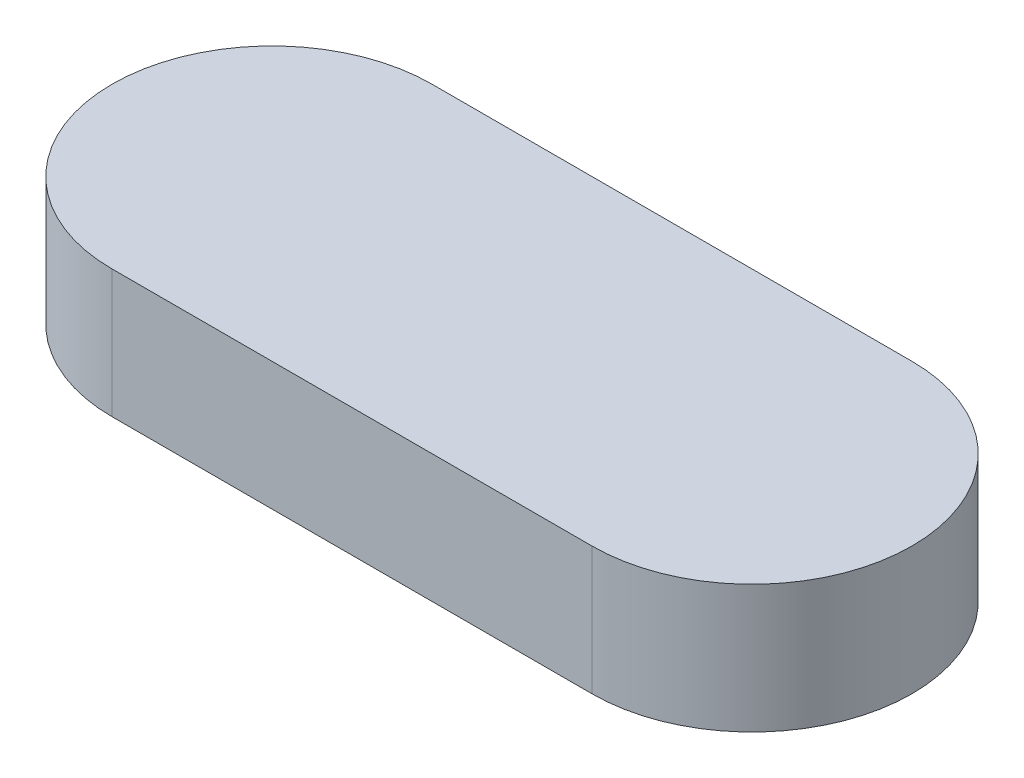
ISO-10303-21;
HEADER;
FILE_DESCRIPTION(('STEP AP214'),'2;1');
FILE_NAME('part.step','',(''),(''),'','','');
FILE_SCHEMA(('AUTOMOTIVE_DESIGN { 1 0 10303 214 1 1 1 1 }'));
ENDSEC;
DATA;
#1=APPLICATION_CONTEXT('core data for automotive mechanical design processes');
#2=APPLICATION_PROTOCOL_DEFINITION('international standard','automotive_design',2000,#1);
#3=PRODUCT_CONTEXT('',#1,'mechanical');
#4=PRODUCT('Part','Part','',(#3));
#5=PRODUCT_RELATED_PRODUCT_CATEGORY('part','',(#4));
#6=PRODUCT_DEFINITION_FORMATION('','',#4);
#7=PRODUCT_DEFINITION_CONTEXT('part definition',#1,'design');
#8=PRODUCT_DEFINITION('design','',#6,#7);
#9=PRODUCT_DEFINITION_SHAPE('','',#8);
#10=(LENGTH_UNIT() NAMED_UNIT(*) SI_UNIT(.MILLI.,.METRE.));
#11=(NAMED_UNIT(*) PLANE_ANGLE_UNIT() SI_UNIT($,.RADIAN.));
#12=(NAMED_UNIT(*) SI_UNIT($,.STERADIAN.) SOLID_ANGLE_UNIT());
#13=UNCERTAINTY_MEASURE_WITH_UNIT(LENGTH_MEASURE(1.E-05),#10,'distance_accuracy_value','');
#14=(GEOMETRIC_REPRESENTATION_CONTEXT(3) GLOBAL_UNCERTAINTY_ASSIGNED_CONTEXT((#13)) GLOBAL_UNIT_ASSIGNED_CONTEXT((#10,
#11,#12)) REPRESENTATION_CONTEXT('',''));
#15=CARTESIAN_POINT('',(0.,0.,0.));
#16=DIRECTION('',(0.,0.,1.));
#17=DIRECTION('',(1.,0.,0.));
#18=AXIS2_PLACEMENT_3D('',#15,#16,#17);
#19=CARTESIAN_POINT('',(-15.,7.99999999999998,-10.));
#20=DIRECTION('',(0.,0.,1.));
#21=DIRECTION('',(1.,0.,0.));
#22=AXIS2_PLACEMENT_3D('',#19,#20,#21);
#23=PLANE('',#22);
#24=DIRECTION('',(-1.,0.,0.));
#25=VECTOR('',#24,1.);
#26=CARTESIAN_POINT('',(15.,0.5,-10.));
#27=LINE('',#26,#25);
#28=CARTESIAN_POINT('',(15.,0.5,-10.));
#29=VERTEX_POINT('',#28);
#30=CARTESIAN_POINT('',(-15.,0.5,-10.));
#31=VERTEX_POINT('',#30);
#32=EDGE_CURVE('E245',#29,#31,#27,.T.);
#33=ORIENTED_EDGE('',*,*,#32,.F.);
#34=DIRECTION('',(0.,-1.,0.));
#35=VECTOR('',#34,1.);
#36=CARTESIAN_POINT('',(15.,7.99999999999998,-10.));
#37=LINE('',#36,#35);
#38=CARTESIAN_POINT('',(15.,0.,-10.));
#39=VERTEX_POINT('',#38);
#40=EDGE_CURVE('E50',#29,#39,#37,.T.);
#41=ORIENTED_EDGE('',*,*,#40,.T.);
#42=DIRECTION('',(-1.,0.,0.));
#43=VECTOR('',#42,1.);
#44=CARTESIAN_POINT('',(-15.,0.,-10.));
#45=LINE('',#44,#43);
#46=CARTESIAN_POINT('',(-15.,0.,-10.));
#47=VERTEX_POINT('',#46);
#48=EDGE_CURVE('E477',#39,#47,#45,.T.);
#49=ORIENTED_EDGE('',*,*,#48,.T.);
#50=DIRECTION('',(0.,-1.,0.));
#51=VECTOR('',#50,1.);
#52=CARTESIAN_POINT('',(-15.,7.99999999999998,-10.));
#53=LINE('',#52,#51);
#54=EDGE_CURVE('E492',#31,#47,#53,.T.);
#55=ORIENTED_EDGE('',*,*,#54,.F.);
#56=EDGE_LOOP('',(#33,#41,#49,#55));
#57=FACE_BOUND('',#56,.T.);
#58=ADVANCED_FACE('F41',(#57),#23,.F.);
#59=CARTESIAN_POINT('',(15.,7.99999999999998,0.));
#60=DIRECTION('',(0.,-1.,0.));
#61=DIRECTION('',(0.,0.,-1.));
#62=AXIS2_PLACEMENT_3D('',#59,#60,#61);
#63=CYLINDRICAL_SURFACE('',#62,10.);
#64=CARTESIAN_POINT('',(15.,0.,0.));
#65=DIRECTION('',(0.,1.,0.));
#66=DIRECTION('',(0.,0.,-1.));
#67=AXIS2_PLACEMENT_3D('',#64,#65,#66);
#68=CIRCLE('',#67,10.);
#69=CARTESIAN_POINT('',(15.,0.,10.));
#70=VERTEX_POINT('',#69);
#71=EDGE_CURVE('E449',#70,#39,#68,.T.);
#72=ORIENTED_EDGE('',*,*,#71,.T.);
#73=ORIENTED_EDGE('',*,*,#40,.F.);
#74=DIRECTION('',(0.,-1.,0.));
#75=VECTOR('',#74,1.);
#76=CARTESIAN_POINT('',(15.,7.99999999999998,-10.));
#77=LINE('',#76,#75);
#78=CARTESIAN_POINT('',(15.,7.49999999999998,-10.));
#79=VERTEX_POINT('',#78);
#80=EDGE_CURVE('E255',#79,#29,#77,.T.);
#81=ORIENTED_EDGE('',*,*,#80,.F.);
#82=CARTESIAN_POINT('',(15.,7.99999999999998,-10.));
#83=VERTEX_POINT('',#82);
#84=EDGE_CURVE('E11',#83,#79,#37,.T.);
#85=ORIENTED_EDGE('',*,*,#84,.F.);
#86=CARTESIAN_POINT('',(15.,7.99999999999998,0.));
#87=DIRECTION('',(0.,1.,0.));
#88=DIRECTION('',(0.,0.,-1.));
#89=AXIS2_PLACEMENT_3D('',#86,#87,#88);
#90=CIRCLE('',#89,10.);
#91=CARTESIAN_POINT('',(15.,7.99999999999998,10.));
#92=VERTEX_POINT('',#91);
#93=EDGE_CURVE('E459',#92,#83,#90,.T.);
#94=ORIENTED_EDGE('',*,*,#93,.F.);
#95=DIRECTION('',(0.,-1.,0.));
#96=VECTOR('',#95,1.);
#97=CARTESIAN_POINT('',(15.,7.99999999999998,10.));
#98=LINE('',#97,#96);
#99=EDGE_CURVE('E473',#92,#70,#98,.T.);
#100=ORIENTED_EDGE('',*,*,#99,.T.);
#101=EDGE_LOOP('',(#72,#73,#81,#85,#94,#100));
#102=FACE_BOUND('',#101,.T.);
#103=ADVANCED_FACE('F43',(#102),#63,.T.);
#104=ORIENTED_EDGE('',*,*,#84,.T.);
#105=DIRECTION('',(-1.,0.,0.));
#106=VECTOR('',#105,1.);
#107=CARTESIAN_POINT('',(15.,7.49999999999998,-10.));
#108=LINE('',#107,#106);
#109=CARTESIAN_POINT('',(-15.,7.49999999999998,-10.));
#110=VERTEX_POINT('',#109);
#111=EDGE_CURVE('E258',#79,#110,#108,.T.);
#112=ORIENTED_EDGE('',*,*,#111,.T.);
#113=CARTESIAN_POINT('',(-15.,7.99999999999998,-10.));
#114=VERTEX_POINT('',#113);
#115=EDGE_CURVE('E493',#114,#110,#53,.T.);
#116=ORIENTED_EDGE('',*,*,#115,.F.);
#117=DIRECTION('',(-1.,0.,0.));
#118=VECTOR('',#117,1.);
#119=CARTESIAN_POINT('',(-15.,7.99999999999998,-10.));
#120=LINE('',#119,#118);
#121=EDGE_CURVE('E463',#83,#114,#120,.T.);
#122=ORIENTED_EDGE('',*,*,#121,.F.);
#123=EDGE_LOOP('',(#104,#112,#116,#122));
#124=FACE_BOUND('',#123,.T.);
#125=ADVANCED_FACE('F525',(#124),#23,.F.);
#126=CARTESIAN_POINT('',(-15.,7.99999999999998,0.));
#127=DIRECTION('',(0.,-1.,0.));
#128=DIRECTION('',(0.,0.,-1.));
#129=AXIS2_PLACEMENT_3D('',#126,#127,#128);
#130=CYLINDRICAL_SURFACE('',#129,10.);
#131=CARTESIAN_POINT('',(-15.,0.,0.));
#132=DIRECTION('',(0.,1.,0.));
#133=DIRECTION('',(0.,0.,1.));
#134=AXIS2_PLACEMENT_3D('',#131,#132,#133);
#135=CIRCLE('',#134,10.);
#136=CARTESIAN_POINT('',(-15.,0.,10.));
#137=VERTEX_POINT('',#136);
#138=EDGE_CURVE('E481',#47,#137,#135,.T.);
#139=ORIENTED_EDGE('',*,*,#138,.T.);
#140=DIRECTION('',(0.,-1.,0.));
#141=VECTOR('',#140,1.);
#142=CARTESIAN_POINT('',(-15.,7.99999999999998,10.));
#143=LINE('',#142,#141);
#144=CARTESIAN_POINT('',(-15.,7.99999999999998,10.));
#145=VERTEX_POINT('',#144);
#146=EDGE_CURVE('E489',#145,#137,#143,.T.);
#147=ORIENTED_EDGE('',*,*,#146,.F.);
#148=CARTESIAN_POINT('',(-15.,7.99999999999998,0.));
#149=DIRECTION('',(0.,1.,0.));
#150=DIRECTION('',(0.,0.,1.));
#151=AXIS2_PLACEMENT_3D('',#148,#149,#150);
#152=CIRCLE('',#151,10.);
#153=EDGE_CURVE('E467',#114,#145,#152,.T.);
#154=ORIENTED_EDGE('',*,*,#153,.F.);
#155=ORIENTED_EDGE('',*,*,#115,.T.);
#156=DIRECTION('',(0.,-1.,0.));
#157=VECTOR('',#156,1.);
#158=CARTESIAN_POINT('',(-15.,7.99999999999998,-10.));
#159=LINE('',#158,#157);
#160=EDGE_CURVE('E265',#110,#31,#159,.T.);
#161=ORIENTED_EDGE('',*,*,#160,.T.);
#162=ORIENTED_EDGE('',*,*,#54,.T.);
#163=EDGE_LOOP('',(#139,#147,#154,#155,#161,#162));
#164=FACE_BOUND('',#163,.T.);
#165=ADVANCED_FACE('F503',(#164),#130,.T.);
#166=CARTESIAN_POINT('',(-15.,7.99999999999998,10.));
#167=DIRECTION('',(0.,0.,-1.));
#168=DIRECTION('',(-1.,0.,0.));
#169=AXIS2_PLACEMENT_3D('',#166,#167,#168);
#170=PLANE('',#169);
#171=DIRECTION('',(1.,0.,0.));
#172=VECTOR('',#171,1.);
#173=CARTESIAN_POINT('',(-15.,0.,10.));
#174=LINE('',#173,#172);
#175=EDGE_CURVE('E464',#137,#70,#174,.T.);
#176=ORIENTED_EDGE('',*,*,#175,.T.);
#177=ORIENTED_EDGE('',*,*,#99,.F.);
#178=DIRECTION('',(1.,0.,0.));
#179=VECTOR('',#178,1.);
#180=CARTESIAN_POINT('',(-15.,7.99999999999998,10.));
#181=LINE('',#180,#179);
#182=EDGE_CURVE('E470',#145,#92,#181,.T.);
#183=ORIENTED_EDGE('',*,*,#182,.F.);
#184=ORIENTED_EDGE('',*,*,#146,.T.);
#185=EDGE_LOOP('',(#176,#177,#183,#184));
#186=FACE_BOUND('',#185,.T.);
#187=ADVANCED_FACE('F516',(#186),#170,.F.);
#188=CARTESIAN_POINT('',(15.,7.99999999999998,0.));
#189=DIRECTION('',(0.,-1.,0.));
#190=DIRECTION('',(0.,0.,-1.));
#191=AXIS2_PLACEMENT_3D('',#188,#189,#190);
#192=PLANE('',#191);
#193=ORIENTED_EDGE('',*,*,#93,.T.);
#194=ORIENTED_EDGE('',*,*,#121,.T.);
#195=ORIENTED_EDGE('',*,*,#153,.T.);
#196=ORIENTED_EDGE('',*,*,#182,.T.);
#197=EDGE_LOOP('',(#193,#194,#195,#196));
#198=FACE_BOUND('',#197,.T.);
#199=ADVANCED_FACE('F523',(#198),#192,.F.);
#200=CARTESIAN_POINT('',(15.,0.,0.));
#201=DIRECTION('',(0.,-1.,0.));
#202=DIRECTION('',(0.,0.,-1.));
#203=AXIS2_PLACEMENT_3D('',#200,#201,#202);
#204=PLANE('',#203);
#205=CARTESIAN_POINT('',(-5.,0.,0.));
#206=DIRECTION('',(0.,-1.,0.));
#207=DIRECTION('',(0.,0.,-1.));
#208=AXIS2_PLACEMENT_3D('',#205,#206,#207);
#209=CIRCLE('',#208,5.);
#210=CARTESIAN_POINT('',(-5.,0.,5.));
#211=VERTEX_POINT('',#210);
#212=CARTESIAN_POINT('',(-5.,0.,-5.));
#213=VERTEX_POINT('',#212);
#214=EDGE_CURVE('E406',#211,#213,#209,.T.);
#215=ORIENTED_EDGE('',*,*,#214,.F.);
#216=DIRECTION('',(-1.,0.,0.));
#217=VECTOR('',#216,1.);
#218=CARTESIAN_POINT('',(-5.,0.,5.));
#219=LINE('',#218,#217);
#220=CARTESIAN_POINT('',(5.,0.,5.));
#221=VERTEX_POINT('',#220);
#222=EDGE_CURVE('E420',#221,#211,#219,.T.);
#223=ORIENTED_EDGE('',*,*,#222,.F.);
#224=CARTESIAN_POINT('',(5.,0.,0.));
#225=DIRECTION('',(0.,-1.,0.));
#226=DIRECTION('',(0.,0.,-1.));
#227=AXIS2_PLACEMENT_3D('',#224,#225,#226);
#228=CIRCLE('',#227,5.);
#229=CARTESIAN_POINT('',(5.,0.,-5.));
#230=VERTEX_POINT('',#229);
#231=EDGE_CURVE('E439',#230,#221,#228,.T.);
#232=ORIENTED_EDGE('',*,*,#231,.F.);
#233=DIRECTION('',(1.,0.,0.));
#234=VECTOR('',#233,1.);
#235=CARTESIAN_POINT('',(-5.,0.,-5.));
#236=LINE('',#235,#234);
#237=EDGE_CURVE('E435',#213,#230,#236,.T.);
#238=ORIENTED_EDGE('',*,*,#237,.F.);
#239=EDGE_LOOP('',(#215,#223,#232,#238));
#240=FACE_BOUND('',#239,.T.);
#241=ORIENTED_EDGE('',*,*,#71,.F.);
#242=ORIENTED_EDGE('',*,*,#175,.F.);
#243=ORIENTED_EDGE('',*,*,#138,.F.);
#244=ORIENTED_EDGE('',*,*,#48,.F.);
#245=EDGE_LOOP('',(#241,#242,#243,#244));
#246=FACE_BOUND('',#245,.T.);
#247=ADVANCED_FACE('F513',(#240,#246),#204,.T.);
#248=CARTESIAN_POINT('',(-5.,0.99999999999999,0.));
#249=DIRECTION('',(0.,-1.,0.));
#250=DIRECTION('',(0.,0.,-1.));
#251=AXIS2_PLACEMENT_3D('',#248,#249,#250);
#252=CYLINDRICAL_SURFACE('',#251,5.);
#253=ORIENTED_EDGE('',*,*,#214,.T.);
#254=DIRECTION('',(0.,-1.,0.));
#255=VECTOR('',#254,1.);
#256=CARTESIAN_POINT('',(-5.,0.99999999999999,-5.));
#257=LINE('',#256,#255);
#258=CARTESIAN_POINT('',(-5.,0.99999999999999,-5.));
#259=VERTEX_POINT('',#258);
#260=EDGE_CURVE('E432',#259,#213,#257,.T.);
#261=ORIENTED_EDGE('',*,*,#260,.F.);
#262=CARTESIAN_POINT('',(-5.,0.99999999999999,0.));
#263=DIRECTION('',(0.,-1.,0.));
#264=DIRECTION('',(0.,0.,-1.));
#265=AXIS2_PLACEMENT_3D('',#262,#263,#264);
#266=CIRCLE('',#265,5.);
#267=CARTESIAN_POINT('',(-5.,0.99999999999999,5.));
#268=VERTEX_POINT('',#267);
#269=EDGE_CURVE('E415',#268,#259,#266,.T.);
#270=ORIENTED_EDGE('',*,*,#269,.F.);
#271=DIRECTION('',(0.,-1.,0.));
#272=VECTOR('',#271,1.);
#273=CARTESIAN_POINT('',(-5.,0.99999999999999,5.));
#274=LINE('',#273,#272);
#275=EDGE_CURVE('E446',#268,#211,#274,.T.);
#276=ORIENTED_EDGE('',*,*,#275,.T.);
#277=EDGE_LOOP('',(#253,#261,#270,#276));
#278=FACE_BOUND('',#277,.T.);
#279=ADVANCED_FACE('F561',(#278),#252,.F.);
#280=CARTESIAN_POINT('',(-5.,0.99999999999999,5.));
#281=DIRECTION('',(0.,0.,1.));
#282=DIRECTION('',(1.,0.,0.));
#283=AXIS2_PLACEMENT_3D('',#280,#281,#282);
#284=PLANE('',#283);
#285=ORIENTED_EDGE('',*,*,#222,.T.);
#286=ORIENTED_EDGE('',*,*,#275,.F.);
#287=DIRECTION('',(-1.,0.,0.));
#288=VECTOR('',#287,1.);
#289=CARTESIAN_POINT('',(-5.,0.99999999999999,5.));
#290=LINE('',#289,#288);
#291=CARTESIAN_POINT('',(5.,0.99999999999999,5.));
#292=VERTEX_POINT('',#291);
#293=EDGE_CURVE('E428',#292,#268,#290,.T.);
#294=ORIENTED_EDGE('',*,*,#293,.F.);
#295=DIRECTION('',(0.,-1.,0.));
#296=VECTOR('',#295,1.);
#297=CARTESIAN_POINT('',(5.,0.99999999999999,5.));
#298=LINE('',#297,#296);
#299=EDGE_CURVE('E450',#292,#221,#298,.T.);
#300=ORIENTED_EDGE('',*,*,#299,.T.);
#301=EDGE_LOOP('',(#285,#286,#294,#300));
#302=FACE_BOUND('',#301,.T.);
#303=ADVANCED_FACE('F567',(#302),#284,.F.);
#304=CARTESIAN_POINT('',(5.,0.99999999999999,0.));
#305=DIRECTION('',(0.,-1.,0.));
#306=DIRECTION('',(0.,0.,-1.));
#307=AXIS2_PLACEMENT_3D('',#304,#305,#306);
#308=CYLINDRICAL_SURFACE('',#307,5.);
#309=ORIENTED_EDGE('',*,*,#231,.T.);
#310=ORIENTED_EDGE('',*,*,#299,.F.);
#311=CARTESIAN_POINT('',(5.,0.99999999999999,0.));
#312=DIRECTION('',(0.,-1.,0.));
#313=DIRECTION('',(0.,0.,-1.));
#314=AXIS2_PLACEMENT_3D('',#311,#312,#313);
#315=CIRCLE('',#314,5.);
#316=CARTESIAN_POINT('',(5.,0.99999999999999,-5.));
#317=VERTEX_POINT('',#316);
#318=EDGE_CURVE('E424',#317,#292,#315,.T.);
#319=ORIENTED_EDGE('',*,*,#318,.F.);
#320=DIRECTION('',(0.,-1.,0.));
#321=VECTOR('',#320,1.);
#322=CARTESIAN_POINT('',(5.,0.99999999999999,-5.));
#323=LINE('',#322,#321);
#324=EDGE_CURVE('E453',#317,#230,#323,.T.);
#325=ORIENTED_EDGE('',*,*,#324,.T.);
#326=EDGE_LOOP('',(#309,#310,#319,#325));
#327=FACE_BOUND('',#326,.T.);
#328=ADVANCED_FACE('F573',(#327),#308,.F.);
#329=CARTESIAN_POINT('',(-5.,0.99999999999999,-5.));
#330=DIRECTION('',(0.,0.,-1.));
#331=DIRECTION('',(-1.,0.,0.));
#332=AXIS2_PLACEMENT_3D('',#329,#330,#331);
#333=PLANE('',#332);
#334=ORIENTED_EDGE('',*,*,#237,.T.);
#335=ORIENTED_EDGE('',*,*,#324,.F.);
#336=DIRECTION('',(1.,0.,0.));
#337=VECTOR('',#336,1.);
#338=CARTESIAN_POINT('',(-5.,0.99999999999999,-5.));
#339=LINE('',#338,#337);
#340=EDGE_CURVE('E419',#259,#317,#339,.T.);
#341=ORIENTED_EDGE('',*,*,#340,.F.);
#342=ORIENTED_EDGE('',*,*,#260,.T.);
#343=EDGE_LOOP('',(#334,#335,#341,#342));
#344=FACE_BOUND('',#343,.T.);
#345=ADVANCED_FACE('F569',(#344),#333,.F.);
#346=CARTESIAN_POINT('',(-5.,0.99999999999999,0.));
#347=DIRECTION('',(0.,-1.,0.));
#348=DIRECTION('',(0.,0.,-1.));
#349=AXIS2_PLACEMENT_3D('',#346,#347,#348);
#350=PLANE('',#349);
#351=DIRECTION('',(0.,0.,1.));
#352=VECTOR('',#351,1.);
#353=CARTESIAN_POINT('',(8.,0.99999999999999,-3.5));
#354=LINE('',#353,#352);
#355=CARTESIAN_POINT('',(8.,0.99999999999999,-3.5));
#356=VERTEX_POINT('',#355);
#357=CARTESIAN_POINT('',(8.,0.99999999999999,3.5));
#358=VERTEX_POINT('',#357);
#359=EDGE_CURVE('E359',#356,#358,#354,.T.);
#360=ORIENTED_EDGE('',*,*,#359,.F.);
#361=DIRECTION('',(1.,0.,0.));
#362=VECTOR('',#361,1.);
#363=CARTESIAN_POINT('',(-8.,0.99999999999999,-3.5));
#364=LINE('',#363,#362);
#365=CARTESIAN_POINT('',(-8.,0.99999999999999,-3.5));
#366=VERTEX_POINT('',#365);
#367=EDGE_CURVE('E381',#366,#356,#364,.T.);
#368=ORIENTED_EDGE('',*,*,#367,.F.);
#369=DIRECTION('',(0.,0.,-1.));
#370=VECTOR('',#369,1.);
#371=CARTESIAN_POINT('',(-8.,0.99999999999999,-3.5));
#372=LINE('',#371,#370);
#373=CARTESIAN_POINT('',(-8.,0.99999999999999,3.5));
#374=VERTEX_POINT('',#373);
#375=EDGE_CURVE('E65',#374,#366,#372,.T.);
#376=ORIENTED_EDGE('',*,*,#375,.F.);
#377=DIRECTION('',(-1.,0.,0.));
#378=VECTOR('',#377,1.);
#379=CARTESIAN_POINT('',(-8.,0.99999999999999,3.5));
#380=LINE('',#379,#378);
#381=EDGE_CURVE('E394',#358,#374,#380,.T.);
#382=ORIENTED_EDGE('',*,*,#381,.F.);
#383=EDGE_LOOP('',(#360,#368,#376,#382));
#384=FACE_BOUND('',#383,.T.);
#385=ORIENTED_EDGE('',*,*,#269,.T.);
#386=ORIENTED_EDGE('',*,*,#340,.T.);
#387=ORIENTED_EDGE('',*,*,#318,.T.);
#388=ORIENTED_EDGE('',*,*,#293,.T.);
#389=EDGE_LOOP('',(#385,#386,#387,#388));
#390=FACE_BOUND('',#389,.T.);
#391=ADVANCED_FACE('F572',(#384,#390),#350,.T.);
#392=CARTESIAN_POINT('',(8.,1.99999999999998,-3.5));
#393=DIRECTION('',(1.,0.,0.));
#394=DIRECTION('',(0.,0.,-1.));
#395=AXIS2_PLACEMENT_3D('',#392,#393,#394);
#396=PLANE('',#395);
#397=ORIENTED_EDGE('',*,*,#359,.T.);
#398=DIRECTION('',(0.,-1.,0.));
#399=VECTOR('',#398,1.);
#400=CARTESIAN_POINT('',(8.,1.99999999999998,3.5));
#401=LINE('',#400,#399);
#402=CARTESIAN_POINT('',(8.,1.99999999999998,3.5));
#403=VERTEX_POINT('',#402);
#404=EDGE_CURVE('E390',#403,#358,#401,.T.);
#405=ORIENTED_EDGE('',*,*,#404,.F.);
#406=DIRECTION('',(0.,0.,1.));
#407=VECTOR('',#406,1.);
#408=CARTESIAN_POINT('',(8.,1.99999999999998,-3.5));
#409=LINE('',#408,#407);
#410=CARTESIAN_POINT('',(8.,1.99999999999998,-3.5));
#411=VERTEX_POINT('',#410);
#412=EDGE_CURVE('E377',#411,#403,#409,.T.);
#413=ORIENTED_EDGE('',*,*,#412,.F.);
#414=DIRECTION('',(0.,-1.,0.));
#415=VECTOR('',#414,1.);
#416=CARTESIAN_POINT('',(8.,1.99999999999998,-3.5));
#417=LINE('',#416,#415);
#418=EDGE_CURVE('E403',#411,#356,#417,.T.);
#419=ORIENTED_EDGE('',*,*,#418,.T.);
#420=EDGE_LOOP('',(#397,#405,#413,#419));
#421=FACE_BOUND('',#420,.T.);
#422=ADVANCED_FACE('F583',(#421),#396,.F.);
#423=CARTESIAN_POINT('',(-8.,1.99999999999998,-3.5));
#424=DIRECTION('',(0.,0.,-1.));
#425=DIRECTION('',(-1.,0.,0.));
#426=AXIS2_PLACEMENT_3D('',#423,#424,#425);
#427=PLANE('',#426);
#428=ORIENTED_EDGE('',*,*,#367,.T.);
#429=ORIENTED_EDGE('',*,*,#418,.F.);
#430=DIRECTION('',(1.,0.,0.));
#431=VECTOR('',#430,1.);
#432=CARTESIAN_POINT('',(-8.,1.99999999999998,-3.5));
#433=LINE('',#432,#431);
#434=CARTESIAN_POINT('',(-8.,1.99999999999998,-3.5));
#435=VERTEX_POINT('',#434);
#436=EDGE_CURVE('E387',#435,#411,#433,.T.);
#437=ORIENTED_EDGE('',*,*,#436,.F.);
#438=DIRECTION('',(0.,-1.,0.));
#439=VECTOR('',#438,1.);
#440=CARTESIAN_POINT('',(-8.,1.99999999999998,-3.5));
#441=LINE('',#440,#439);
#442=EDGE_CURVE('E407',#435,#366,#441,.T.);
#443=ORIENTED_EDGE('',*,*,#442,.T.);
#444=EDGE_LOOP('',(#428,#429,#437,#443));
#445=FACE_BOUND('',#444,.T.);
#446=ADVANCED_FACE('F587',(#445),#427,.F.);
#447=CARTESIAN_POINT('',(-8.,1.99999999999998,-3.5));
#448=DIRECTION('',(-1.,0.,0.));
#449=DIRECTION('',(0.,0.,1.));
#450=AXIS2_PLACEMENT_3D('',#447,#448,#449);
#451=PLANE('',#450);
#452=ORIENTED_EDGE('',*,*,#375,.T.);
#453=ORIENTED_EDGE('',*,*,#442,.F.);
#454=DIRECTION('',(0.,0.,-1.));
#455=VECTOR('',#454,1.);
#456=CARTESIAN_POINT('',(-8.,1.99999999999998,-3.5));
#457=LINE('',#456,#455);
#458=CARTESIAN_POINT('',(-8.,1.99999999999998,3.5));
#459=VERTEX_POINT('',#458);
#460=EDGE_CURVE('E384',#459,#435,#457,.T.);
#461=ORIENTED_EDGE('',*,*,#460,.F.);
#462=DIRECTION('',(0.,-1.,0.));
#463=VECTOR('',#462,1.);
#464=CARTESIAN_POINT('',(-8.,1.99999999999998,3.5));
#465=LINE('',#464,#463);
#466=EDGE_CURVE('E410',#459,#374,#465,.T.);
#467=ORIENTED_EDGE('',*,*,#466,.T.);
#468=EDGE_LOOP('',(#452,#453,#461,#467));
#469=FACE_BOUND('',#468,.T.);
#470=ADVANCED_FACE('F593',(#469),#451,.F.);
#471=CARTESIAN_POINT('',(-8.,1.99999999999998,3.5));
#472=DIRECTION('',(0.,0.,1.));
#473=DIRECTION('',(1.,0.,0.));
#474=AXIS2_PLACEMENT_3D('',#471,#472,#473);
#475=PLANE('',#474);
#476=ORIENTED_EDGE('',*,*,#381,.T.);
#477=ORIENTED_EDGE('',*,*,#466,.F.);
#478=DIRECTION('',(-1.,0.,0.));
#479=VECTOR('',#478,1.);
#480=CARTESIAN_POINT('',(-8.,1.99999999999998,3.5));
#481=LINE('',#480,#479);
#482=EDGE_CURVE('E380',#403,#459,#481,.T.);
#483=ORIENTED_EDGE('',*,*,#482,.F.);
#484=ORIENTED_EDGE('',*,*,#404,.T.);
#485=EDGE_LOOP('',(#476,#477,#483,#484));
#486=FACE_BOUND('',#485,.T.);
#487=ADVANCED_FACE('F589',(#486),#475,.F.);
#488=CARTESIAN_POINT('',(0.,1.99999999999998,0.));
#489=DIRECTION('',(0.,1.,0.));
#490=DIRECTION('',(0.,0.,1.));
#491=AXIS2_PLACEMENT_3D('',#488,#489,#490);
#492=PLANE('',#491);
#493=DIRECTION('',(0.,0.,1.));
#494=VECTOR('',#493,1.);
#495=CARTESIAN_POINT('',(8.5,1.99999999999998,-3.5));
#496=LINE('',#495,#494);
#497=CARTESIAN_POINT('',(8.5,1.99999999999998,-4.));
#498=VERTEX_POINT('',#497);
#499=CARTESIAN_POINT('',(8.5,1.99999999999998,4.));
#500=VERTEX_POINT('',#499);
#501=EDGE_CURVE('E320',#498,#500,#496,.T.);
#502=ORIENTED_EDGE('',*,*,#501,.F.);
#503=DIRECTION('',(1.,0.,0.));
#504=VECTOR('',#503,1.);
#505=CARTESIAN_POINT('',(-8.,1.99999999999998,-4.));
#506=LINE('',#505,#504);
#507=CARTESIAN_POINT('',(-8.5,1.99999999999998,-4.));
#508=VERTEX_POINT('',#507);
#509=EDGE_CURVE('E331',#508,#498,#506,.T.);
#510=ORIENTED_EDGE('',*,*,#509,.F.);
#511=DIRECTION('',(0.,0.,-1.));
#512=VECTOR('',#511,1.);
#513=CARTESIAN_POINT('',(-8.5,1.99999999999998,-3.5));
#514=LINE('',#513,#512);
#515=CARTESIAN_POINT('',(-8.5,1.99999999999998,4.));
#516=VERTEX_POINT('',#515);
#517=EDGE_CURVE('E367',#516,#508,#514,.T.);
#518=ORIENTED_EDGE('',*,*,#517,.F.);
#519=DIRECTION('',(-1.,0.,0.));
#520=VECTOR('',#519,1.);
#521=CARTESIAN_POINT('',(-8.,1.99999999999998,4.));
#522=LINE('',#521,#520);
#523=EDGE_CURVE('E363',#500,#516,#522,.T.);
#524=ORIENTED_EDGE('',*,*,#523,.F.);
#525=EDGE_LOOP('',(#502,#510,#518,#524));
#526=FACE_BOUND('',#525,.T.);
#527=ORIENTED_EDGE('',*,*,#412,.T.);
#528=ORIENTED_EDGE('',*,*,#482,.T.);
#529=ORIENTED_EDGE('',*,*,#460,.T.);
#530=ORIENTED_EDGE('',*,*,#436,.T.);
#531=EDGE_LOOP('',(#527,#528,#529,#530));
#532=FACE_BOUND('',#531,.T.);
#533=ADVANCED_FACE('F592',(#526,#532),#492,.T.);
#534=CARTESIAN_POINT('',(15.,7.99999999999998,-10.));
#535=DIRECTION('',(-1.,0.,0.));
#536=DIRECTION('',(0.,-1.,0.));
#537=AXIS2_PLACEMENT_3D('',#534,#535,#536);
#538=PLANE('',#537);
#539=ORIENTED_EDGE('',*,*,#80,.T.);
#540=DIRECTION('',(0.,0.,1.));
#541=VECTOR('',#540,1.);
#542=CARTESIAN_POINT('',(15.,0.5,-10.));
#543=LINE('',#542,#541);
#544=CARTESIAN_POINT('',(15.,0.5,-9.5));
#545=VERTEX_POINT('',#544);
#546=EDGE_CURVE('E344',#545,#29,#543,.F.);
#547=ORIENTED_EDGE('',*,*,#546,.F.);
#548=DIRECTION('',(0.,-1.,0.));
#549=VECTOR('',#548,1.);
#550=CARTESIAN_POINT('',(15.,3.99999999999999,-9.5));
#551=LINE('',#550,#549);
#552=CARTESIAN_POINT('',(15.,7.49999999999998,-9.5));
#553=VERTEX_POINT('',#552);
#554=EDGE_CURVE('E243',#553,#545,#551,.T.);
#555=ORIENTED_EDGE('',*,*,#554,.F.);
#556=DIRECTION('',(0.,0.,1.));
#557=VECTOR('',#556,1.);
#558=CARTESIAN_POINT('',(15.,7.49999999999998,-10.));
#559=LINE('',#558,#557);
#560=EDGE_CURVE('E57',#553,#79,#559,.F.);
#561=ORIENTED_EDGE('',*,*,#560,.T.);
#562=EDGE_LOOP('',(#539,#547,#555,#561));
#563=FACE_BOUND('',#562,.T.);
#564=ADVANCED_FACE('F531',(#563),#538,.T.);
#565=CARTESIAN_POINT('',(-15.,7.99999999999998,-10.));
#566=DIRECTION('',(-1.,0.,0.));
#567=DIRECTION('',(0.,-1.,0.));
#568=AXIS2_PLACEMENT_3D('',#565,#566,#567);
#569=PLANE('',#568);
#570=ORIENTED_EDGE('',*,*,#160,.F.);
#571=DIRECTION('',(0.,0.,1.));
#572=VECTOR('',#571,1.);
#573=CARTESIAN_POINT('',(-15.,7.49999999999998,-10.));
#574=LINE('',#573,#572);
#575=CARTESIAN_POINT('',(-15.,7.49999999999998,-9.5));
#576=VERTEX_POINT('',#575);
#577=EDGE_CURVE('E342',#576,#110,#574,.F.);
#578=ORIENTED_EDGE('',*,*,#577,.F.);
#579=DIRECTION('',(0.,-1.,0.));
#580=VECTOR('',#579,1.);
#581=CARTESIAN_POINT('',(-15.,3.99999999999999,-9.5));
#582=LINE('',#581,#580);
#583=CARTESIAN_POINT('',(-15.,0.5,-9.5));
#584=VERTEX_POINT('',#583);
#585=EDGE_CURVE('E343',#576,#584,#582,.T.);
#586=ORIENTED_EDGE('',*,*,#585,.T.);
#587=DIRECTION('',(0.,0.,-1.));
#588=VECTOR('',#587,1.);
#589=CARTESIAN_POINT('',(-15.,0.5,0.));
#590=LINE('',#589,#588);
#591=EDGE_CURVE('E346',#584,#31,#590,.T.);
#592=ORIENTED_EDGE('',*,*,#591,.T.);
#593=EDGE_LOOP('',(#570,#578,#586,#592));
#594=FACE_BOUND('',#593,.T.);
#595=ADVANCED_FACE('F533',(#594),#569,.F.);
#596=CARTESIAN_POINT('',(15.,7.99999999999998,0.));
#597=DIRECTION('',(0.,-1.,0.));
#598=DIRECTION('',(0.,0.,-1.));
#599=AXIS2_PLACEMENT_3D('',#596,#597,#598);
#600=CYLINDRICAL_SURFACE('',#599,9.5);
#601=CARTESIAN_POINT('',(15.,0.5,0.));
#602=DIRECTION('',(0.,-1.,0.));
#603=DIRECTION('',(0.,0.,-1.));
#604=AXIS2_PLACEMENT_3D('',#601,#602,#603);
#605=CIRCLE('',#604,9.5);
#606=CARTESIAN_POINT('',(15.,0.5,9.5));
#607=VERTEX_POINT('',#606);
#608=EDGE_CURVE('E221',#607,#545,#605,.F.);
#609=ORIENTED_EDGE('',*,*,#608,.F.);
#610=DIRECTION('',(0.,-1.,0.));
#611=VECTOR('',#610,1.);
#612=CARTESIAN_POINT('',(15.,7.99999999999998,9.5));
#613=LINE('',#612,#611);
#614=CARTESIAN_POINT('',(15.,7.49999999999998,9.5));
#615=VERTEX_POINT('',#614);
#616=EDGE_CURVE('E231',#615,#607,#613,.T.);
#617=ORIENTED_EDGE('',*,*,#616,.F.);
#618=CARTESIAN_POINT('',(15.,7.49999999999998,0.));
#619=DIRECTION('',(0.,-1.,0.));
#620=DIRECTION('',(0.,0.,-1.));
#621=AXIS2_PLACEMENT_3D('',#618,#619,#620);
#622=CIRCLE('',#621,9.5);
#623=EDGE_CURVE('E228',#615,#553,#622,.F.);
#624=ORIENTED_EDGE('',*,*,#623,.T.);
#625=ORIENTED_EDGE('',*,*,#554,.T.);
#626=EDGE_LOOP('',(#609,#617,#624,#625));
#627=FACE_BOUND('',#626,.T.);
#628=ADVANCED_FACE('F242',(#627),#600,.F.);
#629=CARTESIAN_POINT('',(-15.,7.99999999999998,0.));
#630=DIRECTION('',(0.,-1.,0.));
#631=DIRECTION('',(0.,0.,-1.));
#632=AXIS2_PLACEMENT_3D('',#629,#630,#631);
#633=CYLINDRICAL_SURFACE('',#632,9.5);
#634=CARTESIAN_POINT('',(-15.,0.5,0.));
#635=DIRECTION('',(0.,-1.,0.));
#636=DIRECTION('',(0.,0.,-1.));
#637=AXIS2_PLACEMENT_3D('',#634,#635,#636);
#638=CIRCLE('',#637,9.5);
#639=CARTESIAN_POINT('',(-15.,0.5,9.5));
#640=VERTEX_POINT('',#639);
#641=EDGE_CURVE('E223',#584,#640,#638,.F.);
#642=ORIENTED_EDGE('',*,*,#641,.F.);
#643=ORIENTED_EDGE('',*,*,#585,.F.);
#644=CARTESIAN_POINT('',(-15.,7.49999999999998,0.));
#645=DIRECTION('',(0.,-1.,0.));
#646=DIRECTION('',(0.,0.,-1.));
#647=AXIS2_PLACEMENT_3D('',#644,#645,#646);
#648=CIRCLE('',#647,9.5);
#649=CARTESIAN_POINT('',(-15.,7.49999999999998,9.5));
#650=VERTEX_POINT('',#649);
#651=EDGE_CURVE('E262',#576,#650,#648,.F.);
#652=ORIENTED_EDGE('',*,*,#651,.T.);
#653=DIRECTION('',(0.,1.,0.));
#654=VECTOR('',#653,1.);
#655=CARTESIAN_POINT('',(-15.,7.99999999999998,9.5));
#656=LINE('',#655,#654);
#657=EDGE_CURVE('E239',#650,#640,#656,.F.);
#658=ORIENTED_EDGE('',*,*,#657,.T.);
#659=EDGE_LOOP('',(#642,#643,#652,#658));
#660=FACE_BOUND('',#659,.T.);
#661=ADVANCED_FACE('F536',(#660),#633,.F.);
#662=CARTESIAN_POINT('',(-15.,7.99999999999998,9.5));
#663=DIRECTION('',(0.,0.,-1.));
#664=DIRECTION('',(-1.,0.,0.));
#665=AXIS2_PLACEMENT_3D('',#662,#663,#664);
#666=PLANE('',#665);
#667=DIRECTION('',(1.,0.,0.));
#668=VECTOR('',#667,1.);
#669=CARTESIAN_POINT('',(15.,0.5,9.5));
#670=LINE('',#669,#668);
#671=EDGE_CURVE('E216',#640,#607,#670,.T.);
#672=ORIENTED_EDGE('',*,*,#671,.F.);
#673=ORIENTED_EDGE('',*,*,#657,.F.);
#674=DIRECTION('',(1.,0.,0.));
#675=VECTOR('',#674,1.);
#676=CARTESIAN_POINT('',(15.,7.49999999999998,9.5));
#677=LINE('',#676,#675);
#678=EDGE_CURVE('E234',#650,#615,#677,.T.);
#679=ORIENTED_EDGE('',*,*,#678,.T.);
#680=ORIENTED_EDGE('',*,*,#616,.T.);
#681=EDGE_LOOP('',(#672,#673,#679,#680));
#682=FACE_BOUND('',#681,.T.);
#683=ADVANCED_FACE('F232',(#682),#666,.T.);
#684=CARTESIAN_POINT('',(15.,7.49999999999998,0.));
#685=DIRECTION('',(0.,-1.,0.));
#686=DIRECTION('',(0.,0.,-1.));
#687=AXIS2_PLACEMENT_3D('',#684,#685,#686);
#688=PLANE('',#687);
#689=ORIENTED_EDGE('',*,*,#623,.F.);
#690=ORIENTED_EDGE('',*,*,#678,.F.);
#691=ORIENTED_EDGE('',*,*,#651,.F.);
#692=ORIENTED_EDGE('',*,*,#577,.T.);
#693=ORIENTED_EDGE('',*,*,#111,.F.);
#694=ORIENTED_EDGE('',*,*,#560,.F.);
#695=EDGE_LOOP('',(#689,#690,#691,#692,#693,#694));
#696=FACE_BOUND('',#695,.T.);
#697=ADVANCED_FACE('F527',(#696),#688,.T.);
#698=CARTESIAN_POINT('',(15.,0.5,0.));
#699=DIRECTION('',(0.,-1.,0.));
#700=DIRECTION('',(0.,0.,-1.));
#701=AXIS2_PLACEMENT_3D('',#698,#699,#700);
#702=PLANE('',#701);
#703=CARTESIAN_POINT('',(-5.,0.5,0.));
#704=DIRECTION('',(0.,-1.,0.));
#705=DIRECTION('',(0.,0.,-1.));
#706=AXIS2_PLACEMENT_3D('',#703,#704,#705);
#707=CIRCLE('',#706,5.5);
#708=CARTESIAN_POINT('',(-5.,0.5,5.5));
#709=VERTEX_POINT('',#708);
#710=CARTESIAN_POINT('',(-5.,0.5,-5.5));
#711=VERTEX_POINT('',#710);
#712=EDGE_CURVE('E270',#709,#711,#707,.T.);
#713=ORIENTED_EDGE('',*,*,#712,.T.);
#714=DIRECTION('',(1.,0.,0.));
#715=VECTOR('',#714,1.);
#716=CARTESIAN_POINT('',(15.,0.5,-5.5));
#717=LINE('',#716,#715);
#718=CARTESIAN_POINT('',(5.,0.5,-5.5));
#719=VERTEX_POINT('',#718);
#720=EDGE_CURVE('E273',#711,#719,#717,.T.);
#721=ORIENTED_EDGE('',*,*,#720,.T.);
#722=CARTESIAN_POINT('',(5.,0.5,0.));
#723=DIRECTION('',(0.,-1.,0.));
#724=DIRECTION('',(0.,0.,-1.));
#725=AXIS2_PLACEMENT_3D('',#722,#723,#724);
#726=CIRCLE('',#725,5.5);
#727=CARTESIAN_POINT('',(5.,0.5,5.5));
#728=VERTEX_POINT('',#727);
#729=EDGE_CURVE('E280',#719,#728,#726,.T.);
#730=ORIENTED_EDGE('',*,*,#729,.T.);
#731=DIRECTION('',(-1.,0.,0.));
#732=VECTOR('',#731,1.);
#733=CARTESIAN_POINT('',(15.,0.5,5.5));
#734=LINE('',#733,#732);
#735=EDGE_CURVE('E275',#728,#709,#734,.T.);
#736=ORIENTED_EDGE('',*,*,#735,.T.);
#737=EDGE_LOOP('',(#713,#721,#730,#736));
#738=FACE_BOUND('',#737,.T.);
#739=ORIENTED_EDGE('',*,*,#608,.T.);
#740=ORIENTED_EDGE('',*,*,#546,.T.);
#741=ORIENTED_EDGE('',*,*,#32,.T.);
#742=ORIENTED_EDGE('',*,*,#591,.F.);
#743=ORIENTED_EDGE('',*,*,#641,.T.);
#744=ORIENTED_EDGE('',*,*,#671,.T.);
#745=EDGE_LOOP('',(#739,#740,#741,#742,#743,#744));
#746=FACE_BOUND('',#745,.T.);
#747=ADVANCED_FACE('F218',(#738,#746),#702,.F.);
#748=CARTESIAN_POINT('',(-5.,0.99999999999999,0.));
#749=DIRECTION('',(0.,-1.,0.));
#750=DIRECTION('',(0.,0.,-1.));
#751=AXIS2_PLACEMENT_3D('',#748,#749,#750);
#752=CYLINDRICAL_SURFACE('',#751,5.5);
#753=ORIENTED_EDGE('',*,*,#712,.F.);
#754=DIRECTION('',(0.,-1.,0.));
#755=VECTOR('',#754,1.);
#756=CARTESIAN_POINT('',(-5.,0.99999999999999,5.5));
#757=LINE('',#756,#755);
#758=CARTESIAN_POINT('',(-5.,1.49999999999999,5.5));
#759=VERTEX_POINT('',#758);
#760=EDGE_CURVE('E246',#759,#709,#757,.T.);
#761=ORIENTED_EDGE('',*,*,#760,.F.);
#762=CARTESIAN_POINT('',(-5.,1.49999999999999,0.));
#763=DIRECTION('',(0.,-1.,0.));
#764=DIRECTION('',(0.,0.,-1.));
#765=AXIS2_PLACEMENT_3D('',#762,#763,#764);
#766=CIRCLE('',#765,5.5);
#767=CARTESIAN_POINT('',(-5.,1.49999999999999,-5.5));
#768=VERTEX_POINT('',#767);
#769=EDGE_CURVE('E279',#759,#768,#766,.T.);
#770=ORIENTED_EDGE('',*,*,#769,.T.);
#771=DIRECTION('',(0.,1.,0.));
#772=VECTOR('',#771,1.);
#773=CARTESIAN_POINT('',(-5.,0.99999999999999,-5.5));
#774=LINE('',#773,#772);
#775=EDGE_CURVE('E287',#768,#711,#774,.F.);
#776=ORIENTED_EDGE('',*,*,#775,.T.);
#777=EDGE_LOOP('',(#753,#761,#770,#776));
#778=FACE_BOUND('',#777,.T.);
#779=ADVANCED_FACE('F631',(#778),#752,.T.);
#780=CARTESIAN_POINT('',(-5.,0.99999999999999,5.5));
#781=DIRECTION('',(0.,0.,1.));
#782=DIRECTION('',(1.,0.,0.));
#783=AXIS2_PLACEMENT_3D('',#780,#781,#782);
#784=PLANE('',#783);
#785=ORIENTED_EDGE('',*,*,#735,.F.);
#786=DIRECTION('',(0.,1.,0.));
#787=VECTOR('',#786,1.);
#788=CARTESIAN_POINT('',(5.,0.99999999999999,5.5));
#789=LINE('',#788,#787);
#790=CARTESIAN_POINT('',(5.,1.49999999999999,5.5));
#791=VERTEX_POINT('',#790);
#792=EDGE_CURVE('E251',#791,#728,#789,.F.);
#793=ORIENTED_EDGE('',*,*,#792,.F.);
#794=DIRECTION('',(-1.,0.,0.));
#795=VECTOR('',#794,1.);
#796=CARTESIAN_POINT('',(-5.,1.49999999999999,5.5));
#797=LINE('',#796,#795);
#798=EDGE_CURVE('E292',#791,#759,#797,.T.);
#799=ORIENTED_EDGE('',*,*,#798,.T.);
#800=ORIENTED_EDGE('',*,*,#760,.T.);
#801=EDGE_LOOP('',(#785,#793,#799,#800));
#802=FACE_BOUND('',#801,.T.);
#803=ADVANCED_FACE('F627',(#802),#784,.T.);
#804=CARTESIAN_POINT('',(5.,0.99999999999999,0.));
#805=DIRECTION('',(0.,-1.,0.));
#806=DIRECTION('',(0.,0.,-1.));
#807=AXIS2_PLACEMENT_3D('',#804,#805,#806);
#808=CYLINDRICAL_SURFACE('',#807,5.5);
#809=ORIENTED_EDGE('',*,*,#729,.F.);
#810=DIRECTION('',(0.,-1.,0.));
#811=VECTOR('',#810,1.);
#812=CARTESIAN_POINT('',(5.,0.99999999999999,-5.5));
#813=LINE('',#812,#811);
#814=CARTESIAN_POINT('',(5.,1.49999999999999,-5.5));
#815=VERTEX_POINT('',#814);
#816=EDGE_CURVE('E291',#815,#719,#813,.T.);
#817=ORIENTED_EDGE('',*,*,#816,.F.);
#818=CARTESIAN_POINT('',(5.,1.49999999999999,0.));
#819=DIRECTION('',(0.,-1.,0.));
#820=DIRECTION('',(0.,0.,-1.));
#821=AXIS2_PLACEMENT_3D('',#818,#819,#820);
#822=CIRCLE('',#821,5.5);
#823=EDGE_CURVE('E300',#815,#791,#822,.T.);
#824=ORIENTED_EDGE('',*,*,#823,.T.);
#825=ORIENTED_EDGE('',*,*,#792,.T.);
#826=EDGE_LOOP('',(#809,#817,#824,#825));
#827=FACE_BOUND('',#826,.T.);
#828=ADVANCED_FACE('F623',(#827),#808,.T.);
#829=CARTESIAN_POINT('',(-5.,0.99999999999999,-5.5));
#830=DIRECTION('',(0.,0.,-1.));
#831=DIRECTION('',(-1.,0.,0.));
#832=AXIS2_PLACEMENT_3D('',#829,#830,#831);
#833=PLANE('',#832);
#834=ORIENTED_EDGE('',*,*,#720,.F.);
#835=ORIENTED_EDGE('',*,*,#775,.F.);
#836=DIRECTION('',(1.,0.,0.));
#837=VECTOR('',#836,1.);
#838=CARTESIAN_POINT('',(-5.,1.49999999999999,-5.5));
#839=LINE('',#838,#837);
#840=EDGE_CURVE('E295',#768,#815,#839,.T.);
#841=ORIENTED_EDGE('',*,*,#840,.T.);
#842=ORIENTED_EDGE('',*,*,#816,.T.);
#843=EDGE_LOOP('',(#834,#835,#841,#842));
#844=FACE_BOUND('',#843,.T.);
#845=ADVANCED_FACE('F619',(#844),#833,.T.);
#846=CARTESIAN_POINT('',(-5.,1.49999999999999,0.));
#847=DIRECTION('',(0.,-1.,0.));
#848=DIRECTION('',(0.,0.,-1.));
#849=AXIS2_PLACEMENT_3D('',#846,#847,#848);
#850=PLANE('',#849);
#851=DIRECTION('',(0.,0.,1.));
#852=VECTOR('',#851,1.);
#853=CARTESIAN_POINT('',(8.5,1.49999999999999,0.));
#854=LINE('',#853,#852);
#855=CARTESIAN_POINT('',(8.5,1.49999999999999,-4.));
#856=VERTEX_POINT('',#855);
#857=CARTESIAN_POINT('',(8.5,1.49999999999999,4.));
#858=VERTEX_POINT('',#857);
#859=EDGE_CURVE('E311',#856,#858,#854,.T.);
#860=ORIENTED_EDGE('',*,*,#859,.T.);
#861=DIRECTION('',(-1.,0.,0.));
#862=VECTOR('',#861,1.);
#863=CARTESIAN_POINT('',(-5.,1.49999999999999,4.));
#864=LINE('',#863,#862);
#865=CARTESIAN_POINT('',(-8.5,1.49999999999999,4.));
#866=VERTEX_POINT('',#865);
#867=EDGE_CURVE('E315',#858,#866,#864,.T.);
#868=ORIENTED_EDGE('',*,*,#867,.T.);
#869=DIRECTION('',(0.,0.,-1.));
#870=VECTOR('',#869,1.);
#871=CARTESIAN_POINT('',(-8.5,1.49999999999999,0.));
#872=LINE('',#871,#870);
#873=CARTESIAN_POINT('',(-8.5,1.49999999999999,-4.));
#874=VERTEX_POINT('',#873);
#875=EDGE_CURVE('E321',#866,#874,#872,.T.);
#876=ORIENTED_EDGE('',*,*,#875,.T.);
#877=DIRECTION('',(1.,0.,0.));
#878=VECTOR('',#877,1.);
#879=CARTESIAN_POINT('',(-5.,1.49999999999999,-4.));
#880=LINE('',#879,#878);
#881=EDGE_CURVE('E316',#874,#856,#880,.T.);
#882=ORIENTED_EDGE('',*,*,#881,.T.);
#883=EDGE_LOOP('',(#860,#868,#876,#882));
#884=FACE_BOUND('',#883,.T.);
#885=ORIENTED_EDGE('',*,*,#769,.F.);
#886=ORIENTED_EDGE('',*,*,#798,.F.);
#887=ORIENTED_EDGE('',*,*,#823,.F.);
#888=ORIENTED_EDGE('',*,*,#840,.F.);
#889=EDGE_LOOP('',(#885,#886,#887,#888));
#890=FACE_BOUND('',#889,.T.);
#891=ADVANCED_FACE('F615',(#884,#890),#850,.F.);
#892=CARTESIAN_POINT('',(8.5,1.99999999999998,-3.5));
#893=DIRECTION('',(1.,0.,0.));
#894=DIRECTION('',(0.,0.,-1.));
#895=AXIS2_PLACEMENT_3D('',#892,#893,#894);
#896=PLANE('',#895);
#897=ORIENTED_EDGE('',*,*,#859,.F.);
#898=DIRECTION('',(0.,-1.,0.));
#899=VECTOR('',#898,1.);
#900=CARTESIAN_POINT('',(8.5,1.99999999999998,-4.));
#901=LINE('',#900,#899);
#902=EDGE_CURVE('E274',#498,#856,#901,.T.);
#903=ORIENTED_EDGE('',*,*,#902,.F.);
#904=ORIENTED_EDGE('',*,*,#501,.T.);
#905=DIRECTION('',(0.,-1.,0.));
#906=VECTOR('',#905,1.);
#907=CARTESIAN_POINT('',(8.5,1.99999999999998,4.));
#908=LINE('',#907,#906);
#909=EDGE_CURVE('E327',#500,#858,#908,.T.);
#910=ORIENTED_EDGE('',*,*,#909,.T.);
#911=EDGE_LOOP('',(#897,#903,#904,#910));
#912=FACE_BOUND('',#911,.T.);
#913=ADVANCED_FACE('F611',(#912),#896,.T.);
#914=CARTESIAN_POINT('',(-8.,1.99999999999998,-4.));
#915=DIRECTION('',(0.,0.,-1.));
#916=DIRECTION('',(-1.,0.,0.));
#917=AXIS2_PLACEMENT_3D('',#914,#915,#916);
#918=PLANE('',#917);
#919=ORIENTED_EDGE('',*,*,#881,.F.);
#920=DIRECTION('',(0.,-1.,0.));
#921=VECTOR('',#920,1.);
#922=CARTESIAN_POINT('',(-8.5,1.99999999999998,-4.));
#923=LINE('',#922,#921);
#924=EDGE_CURVE('E334',#508,#874,#923,.T.);
#925=ORIENTED_EDGE('',*,*,#924,.F.);
#926=ORIENTED_EDGE('',*,*,#509,.T.);
#927=ORIENTED_EDGE('',*,*,#902,.T.);
#928=EDGE_LOOP('',(#919,#925,#926,#927));
#929=FACE_BOUND('',#928,.T.);
#930=ADVANCED_FACE('F607',(#929),#918,.T.);
#931=CARTESIAN_POINT('',(-8.5,1.99999999999998,-3.5));
#932=DIRECTION('',(-1.,0.,0.));
#933=DIRECTION('',(0.,0.,1.));
#934=AXIS2_PLACEMENT_3D('',#931,#932,#933);
#935=PLANE('',#934);
#936=ORIENTED_EDGE('',*,*,#875,.F.);
#937=DIRECTION('',(0.,-1.,0.));
#938=VECTOR('',#937,1.);
#939=CARTESIAN_POINT('',(-8.5,1.99999999999998,4.));
#940=LINE('',#939,#938);
#941=EDGE_CURVE('E330',#516,#866,#940,.T.);
#942=ORIENTED_EDGE('',*,*,#941,.F.);
#943=ORIENTED_EDGE('',*,*,#517,.T.);
#944=ORIENTED_EDGE('',*,*,#924,.T.);
#945=EDGE_LOOP('',(#936,#942,#943,#944));
#946=FACE_BOUND('',#945,.T.);
#947=ADVANCED_FACE('F603',(#946),#935,.T.);
#948=CARTESIAN_POINT('',(-8.,1.99999999999998,4.));
#949=DIRECTION('',(0.,0.,1.));
#950=DIRECTION('',(1.,0.,0.));
#951=AXIS2_PLACEMENT_3D('',#948,#949,#950);
#952=PLANE('',#951);
#953=ORIENTED_EDGE('',*,*,#867,.F.);
#954=ORIENTED_EDGE('',*,*,#909,.F.);
#955=ORIENTED_EDGE('',*,*,#523,.T.);
#956=ORIENTED_EDGE('',*,*,#941,.T.);
#957=EDGE_LOOP('',(#953,#954,#955,#956));
#958=FACE_BOUND('',#957,.T.);
#959=ADVANCED_FACE('F600',(#958),#952,.T.);
#960=CLOSED_SHELL('',(#58,#103,#125,#165,#187,#199,#247,#279,#303,#328,#345,#391,#422,#446,#470,
#487,#533,#564,#595,#628,#661,#683,#697,#747,#779,#803,#828,#845,#891,#913,#930,#947,#959));
#961=MANIFOLD_SOLID_BREP('B2',#960);
#962=ADVANCED_BREP_SHAPE_REPRESENTATION('',(#18,#961),#14);
#963=SHAPE_DEFINITION_REPRESENTATION(#9,#962);
ENDSEC;
END-ISO-10303-21;
